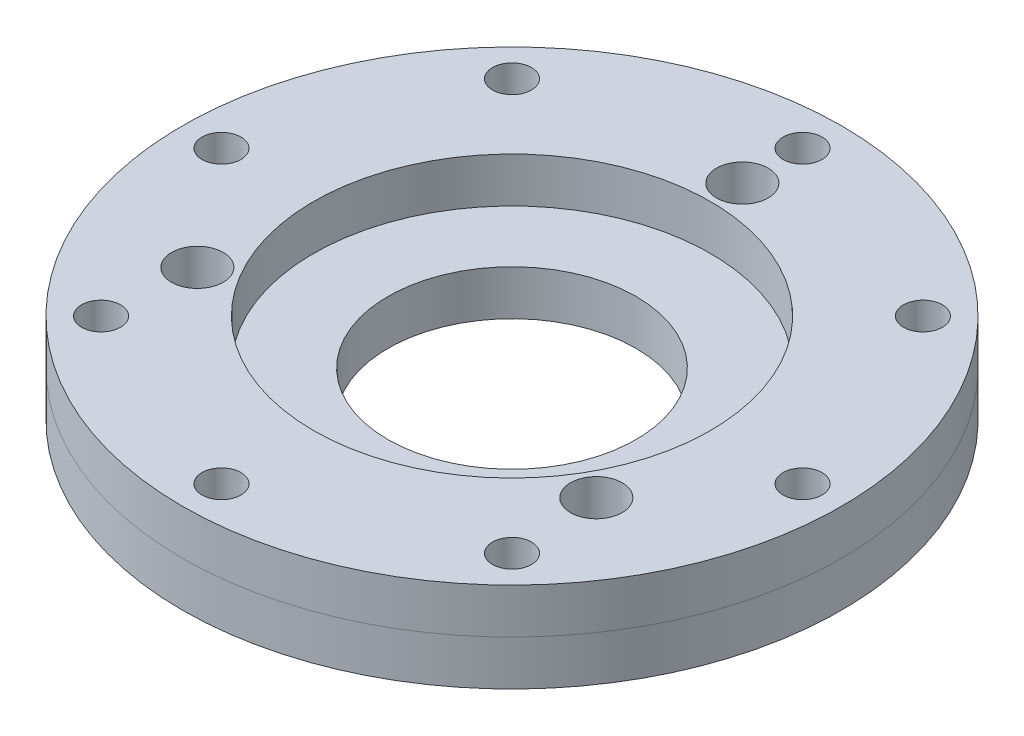
ISO-10303-21;
HEADER;
FILE_DESCRIPTION(('STEP AP214'),'2;1');
FILE_NAME('part.step','',(''),(''),'','','');
FILE_SCHEMA(('AUTOMOTIVE_DESIGN { 1 0 10303 214 1 1 1 1 }'));
ENDSEC;
DATA;
#1=APPLICATION_CONTEXT('core data for automotive mechanical design processes');
#2=APPLICATION_PROTOCOL_DEFINITION('international standard','automotive_design',2000,#1);
#3=PRODUCT_CONTEXT('',#1,'mechanical');
#4=PRODUCT('Part','Part','',(#3));
#5=PRODUCT_RELATED_PRODUCT_CATEGORY('part','',(#4));
#6=PRODUCT_DEFINITION_FORMATION('','',#4);
#7=PRODUCT_DEFINITION_CONTEXT('part definition',#1,'design');
#8=PRODUCT_DEFINITION('design','',#6,#7);
#9=PRODUCT_DEFINITION_SHAPE('','',#8);
#10=(LENGTH_UNIT() NAMED_UNIT(*) SI_UNIT(.MILLI.,.METRE.));
#11=(NAMED_UNIT(*) PLANE_ANGLE_UNIT() SI_UNIT($,.RADIAN.));
#12=(NAMED_UNIT(*) SI_UNIT($,.STERADIAN.) SOLID_ANGLE_UNIT());
#13=UNCERTAINTY_MEASURE_WITH_UNIT(LENGTH_MEASURE(1.E-05),#10,'distance_accuracy_value','');
#14=(GEOMETRIC_REPRESENTATION_CONTEXT(3) GLOBAL_UNCERTAINTY_ASSIGNED_CONTEXT((#13)) GLOBAL_UNIT_ASSIGNED_CONTEXT((#10,
#11,#12)) REPRESENTATION_CONTEXT('',''));
#15=CARTESIAN_POINT('',(0.,0.,0.));
#16=DIRECTION('',(0.,0.,1.));
#17=DIRECTION('',(1.,0.,0.));
#18=AXIS2_PLACEMENT_3D('',#15,#16,#17);
#19=CARTESIAN_POINT('',(0.,6.35,28.));
#20=DIRECTION('',(0.,1.,0.));
#21=DIRECTION('',(0.,0.,1.));
#22=AXIS2_PLACEMENT_3D('',#19,#20,#21);
#23=PLANE('',#22);
#24=CARTESIAN_POINT('',(0.,6.35,-41.));
#25=DIRECTION('',(0.,1.,0.));
#26=DIRECTION('',(0.,0.,1.));
#27=AXIS2_PLACEMENT_3D('',#24,#25,#26);
#28=CIRCLE('',#27,2.1);
#29=CARTESIAN_POINT('',(0.,6.35,-38.9));
#30=VERTEX_POINT('',#29);
#31=EDGE_CURVE('E163',#30,#30,#28,.T.);
#32=ORIENTED_EDGE('',*,*,#31,.F.);
#33=EDGE_LOOP('',(#32));
#34=FACE_BOUND('',#33,.T.);
#35=CARTESIAN_POINT('',(28.9913780286485,6.35,-28.9913780286484));
#36=DIRECTION('',(0.,1.,0.));
#37=DIRECTION('',(0.,0.,1.));
#38=AXIS2_PLACEMENT_3D('',#35,#36,#37);
#39=CIRCLE('',#38,2.10000000000006);
#40=CARTESIAN_POINT('',(28.9913780286485,6.35,-26.8913780286484));
#41=VERTEX_POINT('',#40);
#42=EDGE_CURVE('E219',#41,#41,#39,.T.);
#43=ORIENTED_EDGE('',*,*,#42,.F.);
#44=EDGE_LOOP('',(#43));
#45=FACE_BOUND('',#44,.T.);
#46=CARTESIAN_POINT('',(41.,6.35,0.));
#47=DIRECTION('',(0.,1.,0.));
#48=DIRECTION('',(0.,0.,1.));
#49=AXIS2_PLACEMENT_3D('',#46,#47,#48);
#50=CIRCLE('',#49,2.10000000000013);
#51=CARTESIAN_POINT('',(41.,6.35,2.10000000000013));
#52=VERTEX_POINT('',#51);
#53=EDGE_CURVE('E216',#52,#52,#50,.T.);
#54=ORIENTED_EDGE('',*,*,#53,.F.);
#55=EDGE_LOOP('',(#54));
#56=FACE_BOUND('',#55,.T.);
#57=CARTESIAN_POINT('',(28.9913780286485,6.35,28.9913780286485));
#58=DIRECTION('',(0.,1.,0.));
#59=DIRECTION('',(0.,0.,1.));
#60=AXIS2_PLACEMENT_3D('',#57,#58,#59);
#61=CIRCLE('',#60,2.10000000000021);
#62=CARTESIAN_POINT('',(28.9913780286485,6.35,31.0913780286487));
#63=VERTEX_POINT('',#62);
#64=EDGE_CURVE('E213',#63,#63,#61,.T.);
#65=ORIENTED_EDGE('',*,*,#64,.F.);
#66=EDGE_LOOP('',(#65));
#67=FACE_BOUND('',#66,.T.);
#68=CARTESIAN_POINT('',(0.,6.35,41.));
#69=DIRECTION('',(0.,1.,0.));
#70=DIRECTION('',(0.,0.,1.));
#71=AXIS2_PLACEMENT_3D('',#68,#69,#70);
#72=CIRCLE('',#71,2.10000000000027);
#73=CARTESIAN_POINT('',(0.,6.35,43.1000000000003));
#74=VERTEX_POINT('',#73);
#75=EDGE_CURVE('E210',#74,#74,#72,.T.);
#76=ORIENTED_EDGE('',*,*,#75,.F.);
#77=EDGE_LOOP('',(#76));
#78=FACE_BOUND('',#77,.T.);
#79=CARTESIAN_POINT('',(-28.9913780286484,6.35,28.9913780286485));
#80=DIRECTION('',(0.,1.,0.));
#81=DIRECTION('',(0.,0.,1.));
#82=AXIS2_PLACEMENT_3D('',#79,#80,#81);
#83=CIRCLE('',#82,2.10000000000035);
#84=CARTESIAN_POINT('',(-28.9913780286484,6.35,31.0913780286488));
#85=VERTEX_POINT('',#84);
#86=EDGE_CURVE('E207',#85,#85,#83,.T.);
#87=ORIENTED_EDGE('',*,*,#86,.F.);
#88=EDGE_LOOP('',(#87));
#89=FACE_BOUND('',#88,.T.);
#90=CARTESIAN_POINT('',(-41.,6.35,0.));
#91=DIRECTION('',(0.,1.,0.));
#92=DIRECTION('',(0.,0.,1.));
#93=AXIS2_PLACEMENT_3D('',#90,#91,#92);
#94=CIRCLE('',#93,2.10000000000042);
#95=CARTESIAN_POINT('',(-41.,6.35,2.10000000000043));
#96=VERTEX_POINT('',#95);
#97=EDGE_CURVE('E170',#96,#96,#94,.T.);
#98=ORIENTED_EDGE('',*,*,#97,.F.);
#99=EDGE_LOOP('',(#98));
#100=FACE_BOUND('',#99,.T.);
#101=CARTESIAN_POINT('',(-28.9913780286485,6.35,-28.9913780286484));
#102=DIRECTION('',(0.,1.,0.));
#103=DIRECTION('',(0.,0.,1.));
#104=AXIS2_PLACEMENT_3D('',#101,#102,#103);
#105=CIRCLE('',#104,2.1000000000005);
#106=CARTESIAN_POINT('',(-28.9913780286485,6.35,-26.8913780286479));
#107=VERTEX_POINT('',#106);
#108=EDGE_CURVE('E166',#107,#107,#105,.T.);
#109=ORIENTED_EDGE('',*,*,#108,.F.);
#110=EDGE_LOOP('',(#109));
#111=FACE_BOUND('',#110,.T.);
#112=CARTESIAN_POINT('',(0.,6.35,0.));
#113=DIRECTION('',(0.,1.,0.));
#114=DIRECTION('',(0.,0.,1.));
#115=AXIS2_PLACEMENT_3D('',#112,#113,#114);
#116=CIRCLE('',#115,46.5);
#117=CARTESIAN_POINT('',(0.,6.35,46.5));
#118=VERTEX_POINT('',#117);
#119=EDGE_CURVE('E58',#118,#118,#116,.T.);
#120=ORIENTED_EDGE('',*,*,#119,.T.);
#121=EDGE_LOOP('',(#120));
#122=FACE_BOUND('',#121,.T.);
#123=CARTESIAN_POINT('',(0.,6.35,0.));
#124=DIRECTION('',(0.,1.,0.));
#125=DIRECTION('',(0.,0.,1.));
#126=AXIS2_PLACEMENT_3D('',#123,#124,#125);
#127=CIRCLE('',#126,17.5);
#128=CARTESIAN_POINT('',(0.,6.35,17.5));
#129=VERTEX_POINT('',#128);
#130=EDGE_CURVE('E70',#129,#129,#127,.T.);
#131=ORIENTED_EDGE('',*,*,#130,.F.);
#132=EDGE_LOOP('',(#131));
#133=FACE_BOUND('',#132,.T.);
#134=CARTESIAN_POINT('',(-28.1458256229942,6.35,16.25));
#135=DIRECTION('',(0.,1.,0.));
#136=DIRECTION('',(0.,0.,1.));
#137=AXIS2_PLACEMENT_3D('',#134,#135,#136);
#138=CIRCLE('',#137,2.25);
#139=CARTESIAN_POINT('',(-28.1458256229942,6.35,18.5));
#140=VERTEX_POINT('',#139);
#141=EDGE_CURVE('E13',#140,#140,#138,.T.);
#142=ORIENTED_EDGE('',*,*,#141,.F.);
#143=EDGE_LOOP('',(#142));
#144=FACE_BOUND('',#143,.T.);
#145=CARTESIAN_POINT('',(28.1458256229943,6.35,16.25));
#146=DIRECTION('',(0.,1.,0.));
#147=DIRECTION('',(0.,0.,1.));
#148=AXIS2_PLACEMENT_3D('',#145,#146,#147);
#149=CIRCLE('',#148,2.25);
#150=CARTESIAN_POINT('',(28.1458256229943,6.35,18.5));
#151=VERTEX_POINT('',#150);
#152=EDGE_CURVE('E61',#151,#151,#149,.T.);
#153=ORIENTED_EDGE('',*,*,#152,.F.);
#154=EDGE_LOOP('',(#153));
#155=FACE_BOUND('',#154,.T.);
#156=CARTESIAN_POINT('',(0.,6.35,-32.5));
#157=DIRECTION('',(0.,1.,0.));
#158=DIRECTION('',(0.,0.,1.));
#159=AXIS2_PLACEMENT_3D('',#156,#157,#158);
#160=CIRCLE('',#159,2.25);
#161=CARTESIAN_POINT('',(0.,6.35,-30.25));
#162=VERTEX_POINT('',#161);
#163=EDGE_CURVE('E66',#162,#162,#160,.T.);
#164=ORIENTED_EDGE('',*,*,#163,.F.);
#165=EDGE_LOOP('',(#164));
#166=FACE_BOUND('',#165,.T.);
#167=ADVANCED_FACE('F54',(#34,#45,#56,#67,#78,#89,#100,#111,#122,#133,#144,#155,#166),#23,.T.);
#168=CARTESIAN_POINT('',(0.,0.,0.));
#169=DIRECTION('',(0.,1.,0.));
#170=DIRECTION('',(0.,0.,1.));
#171=AXIS2_PLACEMENT_3D('',#168,#169,#170);
#172=PLANE('',#171);
#173=CARTESIAN_POINT('',(0.,0.,-41.));
#174=DIRECTION('',(0.,1.,0.));
#175=DIRECTION('',(0.,0.,1.));
#176=AXIS2_PLACEMENT_3D('',#173,#174,#175);
#177=CIRCLE('',#176,2.1);
#178=CARTESIAN_POINT('',(0.,0.,-38.9));
#179=VERTEX_POINT('',#178);
#180=EDGE_CURVE('E165',#179,#179,#177,.T.);
#181=ORIENTED_EDGE('',*,*,#180,.T.);
#182=EDGE_LOOP('',(#181));
#183=FACE_BOUND('',#182,.T.);
#184=CARTESIAN_POINT('',(28.9913780286485,0.,-28.9913780286484));
#185=DIRECTION('',(0.,1.,0.));
#186=DIRECTION('',(0.,0.,1.));
#187=AXIS2_PLACEMENT_3D('',#184,#185,#186);
#188=CIRCLE('',#187,2.10000000000006);
#189=CARTESIAN_POINT('',(28.9913780286485,0.,-26.8913780286484));
#190=VERTEX_POINT('',#189);
#191=EDGE_CURVE('E167',#190,#190,#188,.T.);
#192=ORIENTED_EDGE('',*,*,#191,.T.);
#193=EDGE_LOOP('',(#192));
#194=FACE_BOUND('',#193,.T.);
#195=CARTESIAN_POINT('',(41.,0.,0.));
#196=DIRECTION('',(0.,1.,0.));
#197=DIRECTION('',(0.,0.,1.));
#198=AXIS2_PLACEMENT_3D('',#195,#196,#197);
#199=CIRCLE('',#198,2.10000000000013);
#200=CARTESIAN_POINT('',(41.,0.,2.10000000000013));
#201=VERTEX_POINT('',#200);
#202=EDGE_CURVE('E173',#201,#201,#199,.T.);
#203=ORIENTED_EDGE('',*,*,#202,.T.);
#204=EDGE_LOOP('',(#203));
#205=FACE_BOUND('',#204,.T.);
#206=CARTESIAN_POINT('',(28.9913780286485,0.,28.9913780286485));
#207=DIRECTION('',(0.,1.,0.));
#208=DIRECTION('',(0.,0.,1.));
#209=AXIS2_PLACEMENT_3D('',#206,#207,#208);
#210=CIRCLE('',#209,2.10000000000021);
#211=CARTESIAN_POINT('',(28.9913780286485,0.,31.0913780286487));
#212=VERTEX_POINT('',#211);
#213=EDGE_CURVE('E186',#212,#212,#210,.T.);
#214=ORIENTED_EDGE('',*,*,#213,.T.);
#215=EDGE_LOOP('',(#214));
#216=FACE_BOUND('',#215,.T.);
#217=CARTESIAN_POINT('',(0.,0.,41.));
#218=DIRECTION('',(0.,1.,0.));
#219=DIRECTION('',(0.,0.,1.));
#220=AXIS2_PLACEMENT_3D('',#217,#218,#219);
#221=CIRCLE('',#220,2.10000000000027);
#222=CARTESIAN_POINT('',(0.,0.,43.1000000000003));
#223=VERTEX_POINT('',#222);
#224=EDGE_CURVE('E190',#223,#223,#221,.T.);
#225=ORIENTED_EDGE('',*,*,#224,.T.);
#226=EDGE_LOOP('',(#225));
#227=FACE_BOUND('',#226,.T.);
#228=CARTESIAN_POINT('',(-28.9913780286484,0.,28.9913780286485));
#229=DIRECTION('',(0.,1.,0.));
#230=DIRECTION('',(0.,0.,1.));
#231=AXIS2_PLACEMENT_3D('',#228,#229,#230);
#232=CIRCLE('',#231,2.10000000000035);
#233=CARTESIAN_POINT('',(-28.9913780286484,0.,31.0913780286488));
#234=VERTEX_POINT('',#233);
#235=EDGE_CURVE('E194',#234,#234,#232,.T.);
#236=ORIENTED_EDGE('',*,*,#235,.T.);
#237=EDGE_LOOP('',(#236));
#238=FACE_BOUND('',#237,.T.);
#239=CARTESIAN_POINT('',(-41.,0.,0.));
#240=DIRECTION('',(0.,1.,0.));
#241=DIRECTION('',(0.,0.,1.));
#242=AXIS2_PLACEMENT_3D('',#239,#240,#241);
#243=CIRCLE('',#242,2.10000000000042);
#244=CARTESIAN_POINT('',(-41.,0.,2.10000000000043));
#245=VERTEX_POINT('',#244);
#246=EDGE_CURVE('E198',#245,#245,#243,.T.);
#247=ORIENTED_EDGE('',*,*,#246,.T.);
#248=EDGE_LOOP('',(#247));
#249=FACE_BOUND('',#248,.T.);
#250=CARTESIAN_POINT('',(-28.9913780286485,0.,-28.9913780286484));
#251=DIRECTION('',(0.,1.,0.));
#252=DIRECTION('',(0.,0.,1.));
#253=AXIS2_PLACEMENT_3D('',#250,#251,#252);
#254=CIRCLE('',#253,2.1000000000005);
#255=CARTESIAN_POINT('',(-28.9913780286485,0.,-26.8913780286479));
#256=VERTEX_POINT('',#255);
#257=EDGE_CURVE('E201',#256,#256,#254,.T.);
#258=ORIENTED_EDGE('',*,*,#257,.T.);
#259=EDGE_LOOP('',(#258));
#260=FACE_BOUND('',#259,.T.);
#261=CARTESIAN_POINT('',(0.,0.,0.));
#262=DIRECTION('',(0.,1.,0.));
#263=DIRECTION('',(0.,0.,1.));
#264=AXIS2_PLACEMENT_3D('',#261,#262,#263);
#265=CIRCLE('',#264,46.5);
#266=CARTESIAN_POINT('',(0.,0.,46.5));
#267=VERTEX_POINT('',#266);
#268=EDGE_CURVE('E74',#267,#267,#265,.T.);
#269=ORIENTED_EDGE('',*,*,#268,.F.);
#270=EDGE_LOOP('',(#269));
#271=FACE_BOUND('',#270,.T.);
#272=CARTESIAN_POINT('',(0.,0.,-32.5));
#273=DIRECTION('',(0.,1.,0.));
#274=DIRECTION('',(0.,0.,1.));
#275=AXIS2_PLACEMENT_3D('',#272,#273,#274);
#276=CIRCLE('',#275,2.25);
#277=CARTESIAN_POINT('',(0.,0.,-30.25));
#278=VERTEX_POINT('',#277);
#279=EDGE_CURVE('E78',#278,#278,#276,.T.);
#280=ORIENTED_EDGE('',*,*,#279,.T.);
#281=EDGE_LOOP('',(#280));
#282=FACE_BOUND('',#281,.T.);
#283=CARTESIAN_POINT('',(0.,0.,0.));
#284=DIRECTION('',(0.,1.,0.));
#285=DIRECTION('',(0.,0.,1.));
#286=AXIS2_PLACEMENT_3D('',#283,#284,#285);
#287=CIRCLE('',#286,17.5);
#288=CARTESIAN_POINT('',(0.,0.,17.5));
#289=VERTEX_POINT('',#288);
#290=EDGE_CURVE('E88',#289,#289,#287,.T.);
#291=ORIENTED_EDGE('',*,*,#290,.T.);
#292=EDGE_LOOP('',(#291));
#293=FACE_BOUND('',#292,.T.);
#294=CARTESIAN_POINT('',(28.1458256229943,0.,16.25));
#295=DIRECTION('',(0.,1.,0.));
#296=DIRECTION('',(0.,0.,1.));
#297=AXIS2_PLACEMENT_3D('',#294,#295,#296);
#298=CIRCLE('',#297,2.25);
#299=CARTESIAN_POINT('',(28.1458256229943,0.,18.5));
#300=VERTEX_POINT('',#299);
#301=EDGE_CURVE('E91',#300,#300,#298,.T.);
#302=ORIENTED_EDGE('',*,*,#301,.T.);
#303=EDGE_LOOP('',(#302));
#304=FACE_BOUND('',#303,.T.);
#305=CARTESIAN_POINT('',(-28.1458256229942,0.,16.25));
#306=DIRECTION('',(0.,1.,0.));
#307=DIRECTION('',(0.,0.,1.));
#308=AXIS2_PLACEMENT_3D('',#305,#306,#307);
#309=CIRCLE('',#308,2.25);
#310=CARTESIAN_POINT('',(-28.1458256229942,0.,18.5));
#311=VERTEX_POINT('',#310);
#312=EDGE_CURVE('E73',#311,#311,#309,.T.);
#313=ORIENTED_EDGE('',*,*,#312,.T.);
#314=EDGE_LOOP('',(#313));
#315=FACE_BOUND('',#314,.T.);
#316=ADVANCED_FACE('F98',(#183,#194,#205,#216,#227,#238,#249,#260,#271,#282,#293,#304,#315),
#172,.F.);
#317=CARTESIAN_POINT('',(0.,12.7,-32.5));
#318=DIRECTION('',(0.,-1.,0.));
#319=DIRECTION('',(0.,0.,-1.));
#320=AXIS2_PLACEMENT_3D('',#317,#318,#319);
#321=CYLINDRICAL_SURFACE('',#320,2.25);
#322=ORIENTED_EDGE('',*,*,#279,.F.);
#323=EDGE_LOOP('',(#322));
#324=FACE_BOUND('',#323,.T.);
#325=ORIENTED_EDGE('',*,*,#163,.T.);
#326=EDGE_LOOP('',(#325));
#327=FACE_BOUND('',#326,.T.);
#328=ADVANCED_FACE('F111',(#324,#327),#321,.F.);
#329=CARTESIAN_POINT('',(28.1458256229943,12.7,16.25));
#330=DIRECTION('',(0.,-1.,0.));
#331=DIRECTION('',(0.,0.,-1.));
#332=AXIS2_PLACEMENT_3D('',#329,#330,#331);
#333=CYLINDRICAL_SURFACE('',#332,2.25);
#334=ORIENTED_EDGE('',*,*,#301,.F.);
#335=EDGE_LOOP('',(#334));
#336=FACE_BOUND('',#335,.T.);
#337=ORIENTED_EDGE('',*,*,#152,.T.);
#338=EDGE_LOOP('',(#337));
#339=FACE_BOUND('',#338,.T.);
#340=ADVANCED_FACE('F103',(#336,#339),#333,.F.);
#341=CARTESIAN_POINT('',(-28.1458256229942,12.7,16.25));
#342=DIRECTION('',(0.,-1.,0.));
#343=DIRECTION('',(0.,0.,-1.));
#344=AXIS2_PLACEMENT_3D('',#341,#342,#343);
#345=CYLINDRICAL_SURFACE('',#344,2.25);
#346=ORIENTED_EDGE('',*,*,#312,.F.);
#347=EDGE_LOOP('',(#346));
#348=FACE_BOUND('',#347,.T.);
#349=ORIENTED_EDGE('',*,*,#141,.T.);
#350=EDGE_LOOP('',(#349));
#351=FACE_BOUND('',#350,.T.);
#352=ADVANCED_FACE('F100',(#348,#351),#345,.F.);
#353=CARTESIAN_POINT('',(0.,12.7,0.));
#354=DIRECTION('',(0.,-1.,0.));
#355=DIRECTION('',(0.,0.,-1.));
#356=AXIS2_PLACEMENT_3D('',#353,#354,#355);
#357=CYLINDRICAL_SURFACE('',#356,17.5);
#358=ORIENTED_EDGE('',*,*,#290,.F.);
#359=EDGE_LOOP('',(#358));
#360=FACE_BOUND('',#359,.T.);
#361=ORIENTED_EDGE('',*,*,#130,.T.);
#362=EDGE_LOOP('',(#361));
#363=FACE_BOUND('',#362,.T.);
#364=ADVANCED_FACE('F102',(#360,#363),#357,.F.);
#365=CARTESIAN_POINT('',(0.,12.7,0.));
#366=DIRECTION('',(0.,-1.,0.));
#367=DIRECTION('',(0.,0.,-1.));
#368=AXIS2_PLACEMENT_3D('',#365,#366,#367);
#369=CYLINDRICAL_SURFACE('',#368,46.5);
#370=ORIENTED_EDGE('',*,*,#268,.T.);
#371=EDGE_LOOP('',(#370));
#372=FACE_BOUND('',#371,.T.);
#373=ORIENTED_EDGE('',*,*,#119,.F.);
#374=EDGE_LOOP('',(#373));
#375=FACE_BOUND('',#374,.T.);
#376=ADVANCED_FACE('F56',(#372,#375),#369,.T.);
#377=CARTESIAN_POINT('',(-28.9913780286485,0.,-28.9913780286484));
#378=DIRECTION('',(0.,1.,0.));
#379=DIRECTION('',(0.,0.,1.));
#380=AXIS2_PLACEMENT_3D('',#377,#378,#379);
#381=CYLINDRICAL_SURFACE('',#380,2.1000000000005);
#382=ORIENTED_EDGE('',*,*,#108,.T.);
#383=EDGE_LOOP('',(#382));
#384=FACE_BOUND('',#383,.T.);
#385=ORIENTED_EDGE('',*,*,#257,.F.);
#386=EDGE_LOOP('',(#385));
#387=FACE_BOUND('',#386,.T.);
#388=ADVANCED_FACE('F125',(#384,#387),#381,.F.);
#389=CARTESIAN_POINT('',(-41.,0.,0.));
#390=DIRECTION('',(0.,1.,0.));
#391=DIRECTION('',(0.,0.,1.));
#392=AXIS2_PLACEMENT_3D('',#389,#390,#391);
#393=CYLINDRICAL_SURFACE('',#392,2.10000000000042);
#394=ORIENTED_EDGE('',*,*,#97,.T.);
#395=EDGE_LOOP('',(#394));
#396=FACE_BOUND('',#395,.T.);
#397=ORIENTED_EDGE('',*,*,#246,.F.);
#398=EDGE_LOOP('',(#397));
#399=FACE_BOUND('',#398,.T.);
#400=ADVANCED_FACE('F130',(#396,#399),#393,.F.);
#401=CARTESIAN_POINT('',(-28.9913780286484,0.,28.9913780286485));
#402=DIRECTION('',(0.,1.,0.));
#403=DIRECTION('',(0.,0.,1.));
#404=AXIS2_PLACEMENT_3D('',#401,#402,#403);
#405=CYLINDRICAL_SURFACE('',#404,2.10000000000035);
#406=ORIENTED_EDGE('',*,*,#86,.T.);
#407=EDGE_LOOP('',(#406));
#408=FACE_BOUND('',#407,.T.);
#409=ORIENTED_EDGE('',*,*,#235,.F.);
#410=EDGE_LOOP('',(#409));
#411=FACE_BOUND('',#410,.T.);
#412=ADVANCED_FACE('F134',(#408,#411),#405,.F.);
#413=CARTESIAN_POINT('',(0.,0.,41.));
#414=DIRECTION('',(0.,1.,0.));
#415=DIRECTION('',(0.,0.,1.));
#416=AXIS2_PLACEMENT_3D('',#413,#414,#415);
#417=CYLINDRICAL_SURFACE('',#416,2.10000000000027);
#418=ORIENTED_EDGE('',*,*,#75,.T.);
#419=EDGE_LOOP('',(#418));
#420=FACE_BOUND('',#419,.T.);
#421=ORIENTED_EDGE('',*,*,#224,.F.);
#422=EDGE_LOOP('',(#421));
#423=FACE_BOUND('',#422,.T.);
#424=ADVANCED_FACE('F138',(#420,#423),#417,.F.);
#425=CARTESIAN_POINT('',(28.9913780286485,0.,28.9913780286485));
#426=DIRECTION('',(0.,1.,0.));
#427=DIRECTION('',(0.,0.,1.));
#428=AXIS2_PLACEMENT_3D('',#425,#426,#427);
#429=CYLINDRICAL_SURFACE('',#428,2.10000000000021);
#430=ORIENTED_EDGE('',*,*,#64,.T.);
#431=EDGE_LOOP('',(#430));
#432=FACE_BOUND('',#431,.T.);
#433=ORIENTED_EDGE('',*,*,#213,.F.);
#434=EDGE_LOOP('',(#433));
#435=FACE_BOUND('',#434,.T.);
#436=ADVANCED_FACE('F142',(#432,#435),#429,.F.);
#437=CARTESIAN_POINT('',(41.,0.,0.));
#438=DIRECTION('',(0.,1.,0.));
#439=DIRECTION('',(0.,0.,1.));
#440=AXIS2_PLACEMENT_3D('',#437,#438,#439);
#441=CYLINDRICAL_SURFACE('',#440,2.10000000000013);
#442=ORIENTED_EDGE('',*,*,#53,.T.);
#443=EDGE_LOOP('',(#442));
#444=FACE_BOUND('',#443,.T.);
#445=ORIENTED_EDGE('',*,*,#202,.F.);
#446=EDGE_LOOP('',(#445));
#447=FACE_BOUND('',#446,.T.);
#448=ADVANCED_FACE('F146',(#444,#447),#441,.F.);
#449=CARTESIAN_POINT('',(28.9913780286485,0.,-28.9913780286484));
#450=DIRECTION('',(0.,1.,0.));
#451=DIRECTION('',(0.,0.,1.));
#452=AXIS2_PLACEMENT_3D('',#449,#450,#451);
#453=CYLINDRICAL_SURFACE('',#452,2.10000000000006);
#454=ORIENTED_EDGE('',*,*,#42,.T.);
#455=EDGE_LOOP('',(#454));
#456=FACE_BOUND('',#455,.T.);
#457=ORIENTED_EDGE('',*,*,#191,.F.);
#458=EDGE_LOOP('',(#457));
#459=FACE_BOUND('',#458,.T.);
#460=ADVANCED_FACE('F150',(#456,#459),#453,.F.);
#461=CARTESIAN_POINT('',(0.,0.,-41.));
#462=DIRECTION('',(0.,1.,0.));
#463=DIRECTION('',(0.,0.,1.));
#464=AXIS2_PLACEMENT_3D('',#461,#462,#463);
#465=CYLINDRICAL_SURFACE('',#464,2.1);
#466=ORIENTED_EDGE('',*,*,#31,.T.);
#467=EDGE_LOOP('',(#466));
#468=FACE_BOUND('',#467,.T.);
#469=ORIENTED_EDGE('',*,*,#180,.F.);
#470=EDGE_LOOP('',(#469));
#471=FACE_BOUND('',#470,.T.);
#472=ADVANCED_FACE('F154',(#468,#471),#465,.F.);
#473=CLOSED_SHELL('',(#167,#316,#328,#340,#352,#364,#376,#388,#400,#412,#424,#436,#448,#460,#472));
#474=MANIFOLD_SOLID_BREP('B2',#473);
#475=CARTESIAN_POINT('',(0.,6.35,28.));
#476=DIRECTION('',(0.,1.,0.));
#477=DIRECTION('',(0.,0.,1.));
#478=AXIS2_PLACEMENT_3D('',#475,#476,#477);
#479=PLANE('',#478);
#480=CARTESIAN_POINT('',(-28.9913780286485,6.35,-28.9913780286484));
#481=DIRECTION('',(0.,1.,0.));
#482=DIRECTION('',(0.,0.,1.));
#483=AXIS2_PLACEMENT_3D('',#480,#481,#482);
#484=CIRCLE('',#483,2.75);
#485=CARTESIAN_POINT('',(-28.9913780286485,6.35,-26.2413780286484));
#486=VERTEX_POINT('',#485);
#487=EDGE_CURVE('E484',#486,#486,#484,.T.);
#488=ORIENTED_EDGE('',*,*,#487,.T.);
#489=EDGE_LOOP('',(#488));
#490=FACE_BOUND('',#489,.T.);
#491=CARTESIAN_POINT('',(-41.,6.35,0.));
#492=DIRECTION('',(0.,1.,0.));
#493=DIRECTION('',(0.,0.,1.));
#494=AXIS2_PLACEMENT_3D('',#491,#492,#493);
#495=CIRCLE('',#494,2.75);
#496=CARTESIAN_POINT('',(-41.,6.35,2.75000000000001));
#497=VERTEX_POINT('',#496);
#498=EDGE_CURVE('E477',#497,#497,#495,.T.);
#499=ORIENTED_EDGE('',*,*,#498,.T.);
#500=EDGE_LOOP('',(#499));
#501=FACE_BOUND('',#500,.T.);
#502=CARTESIAN_POINT('',(-28.9913780286484,6.35,28.9913780286485));
#503=DIRECTION('',(0.,1.,0.));
#504=DIRECTION('',(0.,0.,1.));
#505=AXIS2_PLACEMENT_3D('',#502,#503,#504);
#506=CIRCLE('',#505,2.75);
#507=CARTESIAN_POINT('',(-28.9913780286484,6.35,31.7413780286485));
#508=VERTEX_POINT('',#507);
#509=EDGE_CURVE('E475',#508,#508,#506,.T.);
#510=ORIENTED_EDGE('',*,*,#509,.T.);
#511=EDGE_LOOP('',(#510));
#512=FACE_BOUND('',#511,.T.);
#513=CARTESIAN_POINT('',(0.,6.35,41.));
#514=DIRECTION('',(0.,1.,0.));
#515=DIRECTION('',(0.,0.,1.));
#516=AXIS2_PLACEMENT_3D('',#513,#514,#515);
#517=CIRCLE('',#516,2.75);
#518=CARTESIAN_POINT('',(0.,6.35,43.75));
#519=VERTEX_POINT('',#518);
#520=EDGE_CURVE('E461',#519,#519,#517,.T.);
#521=ORIENTED_EDGE('',*,*,#520,.T.);
#522=EDGE_LOOP('',(#521));
#523=FACE_BOUND('',#522,.T.);
#524=CARTESIAN_POINT('',(28.9913780286485,6.35,28.9913780286484));
#525=DIRECTION('',(0.,1.,0.));
#526=DIRECTION('',(0.,0.,1.));
#527=AXIS2_PLACEMENT_3D('',#524,#525,#526);
#528=CIRCLE('',#527,2.75);
#529=CARTESIAN_POINT('',(28.9913780286485,6.35,31.7413780286484));
#530=VERTEX_POINT('',#529);
#531=EDGE_CURVE('E454',#530,#530,#528,.T.);
#532=ORIENTED_EDGE('',*,*,#531,.T.);
#533=EDGE_LOOP('',(#532));
#534=FACE_BOUND('',#533,.T.);
#535=CARTESIAN_POINT('',(41.,6.35,0.));
#536=DIRECTION('',(0.,1.,0.));
#537=DIRECTION('',(0.,0.,1.));
#538=AXIS2_PLACEMENT_3D('',#535,#536,#537);
#539=CIRCLE('',#538,2.75);
#540=CARTESIAN_POINT('',(41.,6.35,2.75));
#541=VERTEX_POINT('',#540);
#542=EDGE_CURVE('E452',#541,#541,#539,.T.);
#543=ORIENTED_EDGE('',*,*,#542,.T.);
#544=EDGE_LOOP('',(#543));
#545=FACE_BOUND('',#544,.T.);
#546=CARTESIAN_POINT('',(28.9913780286484,6.35,-28.9913780286484));
#547=DIRECTION('',(0.,1.,0.));
#548=DIRECTION('',(0.,0.,1.));
#549=AXIS2_PLACEMENT_3D('',#546,#547,#548);
#550=CIRCLE('',#549,2.75);
#551=CARTESIAN_POINT('',(28.9913780286484,6.35,-26.2413780286484));
#552=VERTEX_POINT('',#551);
#553=EDGE_CURVE('E428',#552,#552,#550,.T.);
#554=ORIENTED_EDGE('',*,*,#553,.T.);
#555=EDGE_LOOP('',(#554));
#556=FACE_BOUND('',#555,.T.);
#557=CARTESIAN_POINT('',(0.,6.35,-41.));
#558=DIRECTION('',(0.,1.,0.));
#559=DIRECTION('',(0.,0.,1.));
#560=AXIS2_PLACEMENT_3D('',#557,#558,#559);
#561=CIRCLE('',#560,2.75);
#562=CARTESIAN_POINT('',(0.,6.35,-38.25));
#563=VERTEX_POINT('',#562);
#564=EDGE_CURVE('E425',#563,#563,#561,.T.);
#565=ORIENTED_EDGE('',*,*,#564,.T.);
#566=EDGE_LOOP('',(#565));
#567=FACE_BOUND('',#566,.T.);
#568=CARTESIAN_POINT('',(0.,6.35,-32.5));
#569=DIRECTION('',(0.,1.,0.));
#570=DIRECTION('',(0.,0.,1.));
#571=AXIS2_PLACEMENT_3D('',#568,#569,#570);
#572=CIRCLE('',#571,3.65);
#573=CARTESIAN_POINT('',(0.,6.35,-28.85));
#574=VERTEX_POINT('',#573);
#575=EDGE_CURVE('E419',#574,#574,#572,.T.);
#576=ORIENTED_EDGE('',*,*,#575,.T.);
#577=EDGE_LOOP('',(#576));
#578=FACE_BOUND('',#577,.T.);
#579=CARTESIAN_POINT('',(28.1458256229943,6.35,16.25));
#580=DIRECTION('',(0.,1.,0.));
#581=DIRECTION('',(0.,0.,1.));
#582=AXIS2_PLACEMENT_3D('',#579,#580,#581);
#583=CIRCLE('',#582,3.65);
#584=CARTESIAN_POINT('',(28.1458256229943,6.35,19.9));
#585=VERTEX_POINT('',#584);
#586=EDGE_CURVE('E414',#585,#585,#583,.T.);
#587=ORIENTED_EDGE('',*,*,#586,.T.);
#588=EDGE_LOOP('',(#587));
#589=FACE_BOUND('',#588,.T.);
#590=CARTESIAN_POINT('',(-28.1458256229942,6.35,16.25));
#591=DIRECTION('',(0.,1.,0.));
#592=DIRECTION('',(0.,0.,1.));
#593=AXIS2_PLACEMENT_3D('',#590,#591,#592);
#594=CIRCLE('',#593,3.65);
#595=CARTESIAN_POINT('',(-28.1458256229942,6.35,19.9));
#596=VERTEX_POINT('',#595);
#597=EDGE_CURVE('E53',#596,#596,#594,.T.);
#598=ORIENTED_EDGE('',*,*,#597,.T.);
#599=EDGE_LOOP('',(#598));
#600=FACE_BOUND('',#599,.T.);
#601=CARTESIAN_POINT('',(0.,6.35,0.));
#602=DIRECTION('',(0.,1.,0.));
#603=DIRECTION('',(0.,0.,1.));
#604=AXIS2_PLACEMENT_3D('',#601,#602,#603);
#605=CIRCLE('',#604,28.);
#606=CARTESIAN_POINT('',(0.,6.35,28.));
#607=VERTEX_POINT('',#606);
#608=EDGE_CURVE('E429',#607,#607,#605,.T.);
#609=ORIENTED_EDGE('',*,*,#608,.T.);
#610=EDGE_LOOP('',(#609));
#611=FACE_BOUND('',#610,.T.);
#612=CARTESIAN_POINT('',(0.,6.35,0.));
#613=DIRECTION('',(0.,1.,0.));
#614=DIRECTION('',(0.,0.,1.));
#615=AXIS2_PLACEMENT_3D('',#612,#613,#614);
#616=CIRCLE('',#615,46.5);
#617=CARTESIAN_POINT('',(0.,6.35,46.5));
#618=VERTEX_POINT('',#617);
#619=EDGE_CURVE('E411',#618,#618,#616,.T.);
#620=ORIENTED_EDGE('',*,*,#619,.F.);
#621=EDGE_LOOP('',(#620));
#622=FACE_BOUND('',#621,.T.);
#623=ADVANCED_FACE('F408',(#490,#501,#512,#523,#534,#545,#556,#567,#578,#589,#600,#611,#622),
#479,.F.);
#624=CARTESIAN_POINT('',(0.,12.7,0.));
#625=DIRECTION('',(0.,1.,0.));
#626=DIRECTION('',(0.,0.,1.));
#627=AXIS2_PLACEMENT_3D('',#624,#625,#626);
#628=PLANE('',#627);
#629=CARTESIAN_POINT('',(0.,12.7,-32.5));
#630=DIRECTION('',(0.,1.,0.));
#631=DIRECTION('',(0.,0.,1.));
#632=AXIS2_PLACEMENT_3D('',#629,#630,#631);
#633=CIRCLE('',#632,3.65);
#634=CARTESIAN_POINT('',(0.,12.7,-28.85));
#635=VERTEX_POINT('',#634);
#636=EDGE_CURVE('E488',#635,#635,#633,.T.);
#637=ORIENTED_EDGE('',*,*,#636,.F.);
#638=EDGE_LOOP('',(#637));
#639=FACE_BOUND('',#638,.T.);
#640=CARTESIAN_POINT('',(28.1458256229943,12.7,16.25));
#641=DIRECTION('',(0.,1.,0.));
#642=DIRECTION('',(0.,0.,1.));
#643=AXIS2_PLACEMENT_3D('',#640,#641,#642);
#644=CIRCLE('',#643,3.65);
#645=CARTESIAN_POINT('',(28.1458256229943,12.7,19.9));
#646=VERTEX_POINT('',#645);
#647=EDGE_CURVE('E586',#646,#646,#644,.T.);
#648=ORIENTED_EDGE('',*,*,#647,.F.);
#649=EDGE_LOOP('',(#648));
#650=FACE_BOUND('',#649,.T.);
#651=CARTESIAN_POINT('',(-28.1458256229942,12.7,16.25));
#652=DIRECTION('',(0.,1.,0.));
#653=DIRECTION('',(0.,0.,1.));
#654=AXIS2_PLACEMENT_3D('',#651,#652,#653);
#655=CIRCLE('',#654,3.65);
#656=CARTESIAN_POINT('',(-28.1458256229942,12.7,19.9));
#657=VERTEX_POINT('',#656);
#658=EDGE_CURVE('E423',#657,#657,#655,.T.);
#659=ORIENTED_EDGE('',*,*,#658,.F.);
#660=EDGE_LOOP('',(#659));
#661=FACE_BOUND('',#660,.T.);
#662=CARTESIAN_POINT('',(0.,12.7,-41.));
#663=DIRECTION('',(0.,1.,0.));
#664=DIRECTION('',(0.,0.,1.));
#665=AXIS2_PLACEMENT_3D('',#662,#663,#664);
#666=CIRCLE('',#665,2.75);
#667=CARTESIAN_POINT('',(0.,12.7,-38.25));
#668=VERTEX_POINT('',#667);
#669=EDGE_CURVE('E430',#668,#668,#666,.T.);
#670=ORIENTED_EDGE('',*,*,#669,.F.);
#671=EDGE_LOOP('',(#670));
#672=FACE_BOUND('',#671,.T.);
#673=CARTESIAN_POINT('',(28.9913780286484,12.7,-28.9913780286484));
#674=DIRECTION('',(0.,1.,0.));
#675=DIRECTION('',(0.,0.,1.));
#676=AXIS2_PLACEMENT_3D('',#673,#674,#675);
#677=CIRCLE('',#676,2.75);
#678=CARTESIAN_POINT('',(28.9913780286484,12.7,-26.2413780286484));
#679=VERTEX_POINT('',#678);
#680=EDGE_CURVE('E435',#679,#679,#677,.T.);
#681=ORIENTED_EDGE('',*,*,#680,.F.);
#682=EDGE_LOOP('',(#681));
#683=FACE_BOUND('',#682,.T.);
#684=CARTESIAN_POINT('',(41.,12.7,0.));
#685=DIRECTION('',(0.,1.,0.));
#686=DIRECTION('',(0.,0.,1.));
#687=AXIS2_PLACEMENT_3D('',#684,#685,#686);
#688=CIRCLE('',#687,2.75);
#689=CARTESIAN_POINT('',(41.,12.7,2.75));
#690=VERTEX_POINT('',#689);
#691=EDGE_CURVE('E447',#690,#690,#688,.T.);
#692=ORIENTED_EDGE('',*,*,#691,.F.);
#693=EDGE_LOOP('',(#692));
#694=FACE_BOUND('',#693,.T.);
#695=CARTESIAN_POINT('',(28.9913780286485,12.7,28.9913780286484));
#696=DIRECTION('',(0.,1.,0.));
#697=DIRECTION('',(0.,0.,1.));
#698=AXIS2_PLACEMENT_3D('',#695,#696,#697);
#699=CIRCLE('',#698,2.75);
#700=CARTESIAN_POINT('',(28.9913780286485,12.7,31.7413780286484));
#701=VERTEX_POINT('',#700);
#702=EDGE_CURVE('E451',#701,#701,#699,.T.);
#703=ORIENTED_EDGE('',*,*,#702,.F.);
#704=EDGE_LOOP('',(#703));
#705=FACE_BOUND('',#704,.T.);
#706=CARTESIAN_POINT('',(0.,12.7,41.));
#707=DIRECTION('',(0.,1.,0.));
#708=DIRECTION('',(0.,0.,1.));
#709=AXIS2_PLACEMENT_3D('',#706,#707,#708);
#710=CIRCLE('',#709,2.75);
#711=CARTESIAN_POINT('',(0.,12.7,43.75));
#712=VERTEX_POINT('',#711);
#713=EDGE_CURVE('E458',#712,#712,#710,.T.);
#714=ORIENTED_EDGE('',*,*,#713,.F.);
#715=EDGE_LOOP('',(#714));
#716=FACE_BOUND('',#715,.T.);
#717=CARTESIAN_POINT('',(-28.9913780286484,12.7,28.9913780286485));
#718=DIRECTION('',(0.,1.,0.));
#719=DIRECTION('',(0.,0.,1.));
#720=AXIS2_PLACEMENT_3D('',#717,#718,#719);
#721=CIRCLE('',#720,2.75);
#722=CARTESIAN_POINT('',(-28.9913780286484,12.7,31.7413780286485));
#723=VERTEX_POINT('',#722);
#724=EDGE_CURVE('E465',#723,#723,#721,.T.);
#725=ORIENTED_EDGE('',*,*,#724,.F.);
#726=EDGE_LOOP('',(#725));
#727=FACE_BOUND('',#726,.T.);
#728=CARTESIAN_POINT('',(-41.,12.7,0.));
#729=DIRECTION('',(0.,1.,0.));
#730=DIRECTION('',(0.,0.,1.));
#731=AXIS2_PLACEMENT_3D('',#728,#729,#730);
#732=CIRCLE('',#731,2.75);
#733=CARTESIAN_POINT('',(-41.,12.7,2.75000000000001));
#734=VERTEX_POINT('',#733);
#735=EDGE_CURVE('E474',#734,#734,#732,.T.);
#736=ORIENTED_EDGE('',*,*,#735,.F.);
#737=EDGE_LOOP('',(#736));
#738=FACE_BOUND('',#737,.T.);
#739=CARTESIAN_POINT('',(-28.9913780286485,12.7,-28.9913780286484));
#740=DIRECTION('',(0.,1.,0.));
#741=DIRECTION('',(0.,0.,1.));
#742=AXIS2_PLACEMENT_3D('',#739,#740,#741);
#743=CIRCLE('',#742,2.75);
#744=CARTESIAN_POINT('',(-28.9913780286485,12.7,-26.2413780286484));
#745=VERTEX_POINT('',#744);
#746=EDGE_CURVE('E481',#745,#745,#743,.T.);
#747=ORIENTED_EDGE('',*,*,#746,.F.);
#748=EDGE_LOOP('',(#747));
#749=FACE_BOUND('',#748,.T.);
#750=CARTESIAN_POINT('',(0.,12.7,0.));
#751=DIRECTION('',(0.,1.,0.));
#752=DIRECTION('',(0.,0.,1.));
#753=AXIS2_PLACEMENT_3D('',#750,#751,#752);
#754=CIRCLE('',#753,28.);
#755=CARTESIAN_POINT('',(0.,12.7,28.));
#756=VERTEX_POINT('',#755);
#757=EDGE_CURVE('E434',#756,#756,#754,.T.);
#758=ORIENTED_EDGE('',*,*,#757,.F.);
#759=EDGE_LOOP('',(#758));
#760=FACE_BOUND('',#759,.T.);
#761=CARTESIAN_POINT('',(0.,12.7,0.));
#762=DIRECTION('',(0.,1.,0.));
#763=DIRECTION('',(0.,0.,1.));
#764=AXIS2_PLACEMENT_3D('',#761,#762,#763);
#765=CIRCLE('',#764,46.5);
#766=CARTESIAN_POINT('',(0.,12.7,46.5));
#767=VERTEX_POINT('',#766);
#768=EDGE_CURVE('E493',#767,#767,#765,.T.);
#769=ORIENTED_EDGE('',*,*,#768,.T.);
#770=EDGE_LOOP('',(#769));
#771=FACE_BOUND('',#770,.T.);
#772=ADVANCED_FACE('F514',(#639,#650,#661,#672,#683,#694,#705,#716,#727,#738,#749,#760,#771),
#628,.T.);
#773=CARTESIAN_POINT('',(0.,6.35,-32.5));
#774=DIRECTION('',(0.,1.,0.));
#775=DIRECTION('',(0.,0.,1.));
#776=AXIS2_PLACEMENT_3D('',#773,#774,#775);
#777=CYLINDRICAL_SURFACE('',#776,3.65);
#778=ORIENTED_EDGE('',*,*,#575,.F.);
#779=EDGE_LOOP('',(#778));
#780=FACE_BOUND('',#779,.T.);
#781=ORIENTED_EDGE('',*,*,#636,.T.);
#782=EDGE_LOOP('',(#781));
#783=FACE_BOUND('',#782,.T.);
#784=ADVANCED_FACE('F516',(#780,#783),#777,.F.);
#785=CARTESIAN_POINT('',(28.1458256229943,6.35,16.25));
#786=DIRECTION('',(0.,1.,0.));
#787=DIRECTION('',(0.,0.,1.));
#788=AXIS2_PLACEMENT_3D('',#785,#786,#787);
#789=CYLINDRICAL_SURFACE('',#788,3.65);
#790=ORIENTED_EDGE('',*,*,#586,.F.);
#791=EDGE_LOOP('',(#790));
#792=FACE_BOUND('',#791,.T.);
#793=ORIENTED_EDGE('',*,*,#647,.T.);
#794=EDGE_LOOP('',(#793));
#795=FACE_BOUND('',#794,.T.);
#796=ADVANCED_FACE('F523',(#792,#795),#789,.F.);
#797=CARTESIAN_POINT('',(-28.1458256229942,6.35,16.25));
#798=DIRECTION('',(0.,1.,0.));
#799=DIRECTION('',(0.,0.,1.));
#800=AXIS2_PLACEMENT_3D('',#797,#798,#799);
#801=CYLINDRICAL_SURFACE('',#800,3.65);
#802=ORIENTED_EDGE('',*,*,#597,.F.);
#803=EDGE_LOOP('',(#802));
#804=FACE_BOUND('',#803,.T.);
#805=ORIENTED_EDGE('',*,*,#658,.T.);
#806=EDGE_LOOP('',(#805));
#807=FACE_BOUND('',#806,.T.);
#808=ADVANCED_FACE('F510',(#804,#807),#801,.F.);
#809=CARTESIAN_POINT('',(0.,6.35,0.));
#810=DIRECTION('',(0.,1.,0.));
#811=DIRECTION('',(0.,0.,1.));
#812=AXIS2_PLACEMENT_3D('',#809,#810,#811);
#813=CYLINDRICAL_SURFACE('',#812,28.);
#814=ORIENTED_EDGE('',*,*,#608,.F.);
#815=EDGE_LOOP('',(#814));
#816=FACE_BOUND('',#815,.T.);
#817=ORIENTED_EDGE('',*,*,#757,.T.);
#818=EDGE_LOOP('',(#817));
#819=FACE_BOUND('',#818,.T.);
#820=ADVANCED_FACE('F506',(#816,#819),#813,.F.);
#821=CARTESIAN_POINT('',(0.,12.7,0.));
#822=DIRECTION('',(0.,-1.,0.));
#823=DIRECTION('',(0.,0.,-1.));
#824=AXIS2_PLACEMENT_3D('',#821,#822,#823);
#825=CYLINDRICAL_SURFACE('',#824,46.5);
#826=ORIENTED_EDGE('',*,*,#619,.T.);
#827=EDGE_LOOP('',(#826));
#828=FACE_BOUND('',#827,.T.);
#829=ORIENTED_EDGE('',*,*,#768,.F.);
#830=EDGE_LOOP('',(#829));
#831=FACE_BOUND('',#830,.T.);
#832=ADVANCED_FACE('F509',(#828,#831),#825,.T.);
#833=CARTESIAN_POINT('',(0.,6.35,-41.));
#834=DIRECTION('',(0.,1.,0.));
#835=DIRECTION('',(0.,0.,1.));
#836=AXIS2_PLACEMENT_3D('',#833,#834,#835);
#837=CYLINDRICAL_SURFACE('',#836,2.75);
#838=ORIENTED_EDGE('',*,*,#564,.F.);
#839=EDGE_LOOP('',(#838));
#840=FACE_BOUND('',#839,.T.);
#841=ORIENTED_EDGE('',*,*,#669,.T.);
#842=EDGE_LOOP('',(#841));
#843=FACE_BOUND('',#842,.T.);
#844=ADVANCED_FACE('F533',(#840,#843),#837,.F.);
#845=CARTESIAN_POINT('',(28.9913780286484,6.35,-28.9913780286484));
#846=DIRECTION('',(0.,1.,0.));
#847=DIRECTION('',(0.,0.,1.));
#848=AXIS2_PLACEMENT_3D('',#845,#846,#847);
#849=CYLINDRICAL_SURFACE('',#848,2.75);
#850=ORIENTED_EDGE('',*,*,#553,.F.);
#851=EDGE_LOOP('',(#850));
#852=FACE_BOUND('',#851,.T.);
#853=ORIENTED_EDGE('',*,*,#680,.T.);
#854=EDGE_LOOP('',(#853));
#855=FACE_BOUND('',#854,.T.);
#856=ADVANCED_FACE('F536',(#852,#855),#849,.F.);
#857=CARTESIAN_POINT('',(41.,6.35,0.));
#858=DIRECTION('',(0.,1.,0.));
#859=DIRECTION('',(0.,0.,1.));
#860=AXIS2_PLACEMENT_3D('',#857,#858,#859);
#861=CYLINDRICAL_SURFACE('',#860,2.75);
#862=ORIENTED_EDGE('',*,*,#542,.F.);
#863=EDGE_LOOP('',(#862));
#864=FACE_BOUND('',#863,.T.);
#865=ORIENTED_EDGE('',*,*,#691,.T.);
#866=EDGE_LOOP('',(#865));
#867=FACE_BOUND('',#866,.T.);
#868=ADVANCED_FACE('F543',(#864,#867),#861,.F.);
#869=CARTESIAN_POINT('',(28.9913780286485,6.35,28.9913780286484));
#870=DIRECTION('',(0.,1.,0.));
#871=DIRECTION('',(0.,0.,1.));
#872=AXIS2_PLACEMENT_3D('',#869,#870,#871);
#873=CYLINDRICAL_SURFACE('',#872,2.75);
#874=ORIENTED_EDGE('',*,*,#531,.F.);
#875=EDGE_LOOP('',(#874));
#876=FACE_BOUND('',#875,.T.);
#877=ORIENTED_EDGE('',*,*,#702,.T.);
#878=EDGE_LOOP('',(#877));
#879=FACE_BOUND('',#878,.T.);
#880=ADVANCED_FACE('F553',(#876,#879),#873,.F.);
#881=CARTESIAN_POINT('',(0.,6.35,41.));
#882=DIRECTION('',(0.,1.,0.));
#883=DIRECTION('',(0.,0.,1.));
#884=AXIS2_PLACEMENT_3D('',#881,#882,#883);
#885=CYLINDRICAL_SURFACE('',#884,2.75);
#886=ORIENTED_EDGE('',*,*,#520,.F.);
#887=EDGE_LOOP('',(#886));
#888=FACE_BOUND('',#887,.T.);
#889=ORIENTED_EDGE('',*,*,#713,.T.);
#890=EDGE_LOOP('',(#889));
#891=FACE_BOUND('',#890,.T.);
#892=ADVANCED_FACE('F557',(#888,#891),#885,.F.);
#893=CARTESIAN_POINT('',(-28.9913780286484,6.35,28.9913780286485));
#894=DIRECTION('',(0.,1.,0.));
#895=DIRECTION('',(0.,0.,1.));
#896=AXIS2_PLACEMENT_3D('',#893,#894,#895);
#897=CYLINDRICAL_SURFACE('',#896,2.75);
#898=ORIENTED_EDGE('',*,*,#509,.F.);
#899=EDGE_LOOP('',(#898));
#900=FACE_BOUND('',#899,.T.);
#901=ORIENTED_EDGE('',*,*,#724,.T.);
#902=EDGE_LOOP('',(#901));
#903=FACE_BOUND('',#902,.T.);
#904=ADVANCED_FACE('F561',(#900,#903),#897,.F.);
#905=CARTESIAN_POINT('',(-41.,6.35,0.));
#906=DIRECTION('',(0.,1.,0.));
#907=DIRECTION('',(0.,0.,1.));
#908=AXIS2_PLACEMENT_3D('',#905,#906,#907);
#909=CYLINDRICAL_SURFACE('',#908,2.75);
#910=ORIENTED_EDGE('',*,*,#498,.F.);
#911=EDGE_LOOP('',(#910));
#912=FACE_BOUND('',#911,.T.);
#913=ORIENTED_EDGE('',*,*,#735,.T.);
#914=EDGE_LOOP('',(#913));
#915=FACE_BOUND('',#914,.T.);
#916=ADVANCED_FACE('F565',(#912,#915),#909,.F.);
#917=CARTESIAN_POINT('',(-28.9913780286485,6.35,-28.9913780286484));
#918=DIRECTION('',(0.,1.,0.));
#919=DIRECTION('',(0.,0.,1.));
#920=AXIS2_PLACEMENT_3D('',#917,#918,#919);
#921=CYLINDRICAL_SURFACE('',#920,2.75);
#922=ORIENTED_EDGE('',*,*,#487,.F.);
#923=EDGE_LOOP('',(#922));
#924=FACE_BOUND('',#923,.T.);
#925=ORIENTED_EDGE('',*,*,#746,.T.);
#926=EDGE_LOOP('',(#925));
#927=FACE_BOUND('',#926,.T.);
#928=ADVANCED_FACE('F528',(#924,#927),#921,.F.);
#929=CLOSED_SHELL('',(#623,#772,#784,#796,#808,#820,#832,#844,#856,#868,#880,#892,#904,#916,#928));
#930=MANIFOLD_SOLID_BREP('B8',#929);
#931=ADVANCED_BREP_SHAPE_REPRESENTATION('',(#18,#474,#930),#14);
#932=SHAPE_DEFINITION_REPRESENTATION(#9,#931);
ENDSEC;
END-ISO-10303-21;
